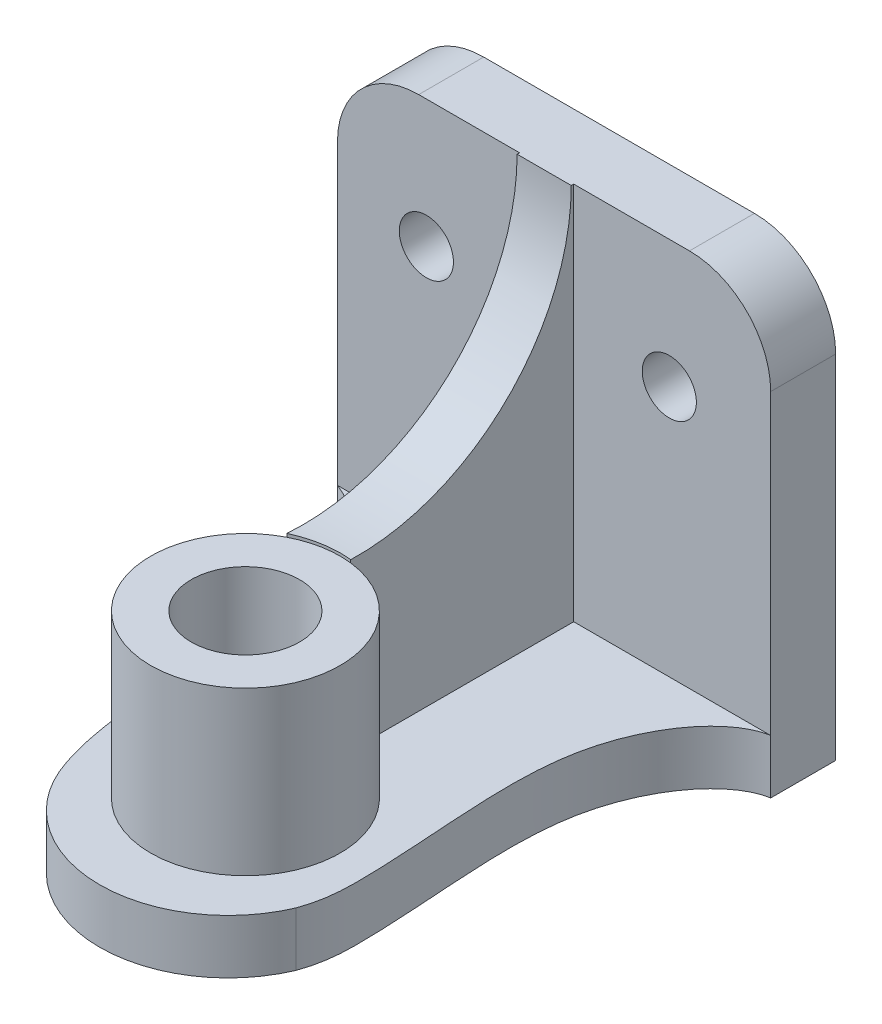
ISO-10303-21;
HEADER;
FILE_DESCRIPTION(('STEP AP214'),'2;1');
FILE_NAME('part.step','',(''),(''),'','','');
FILE_SCHEMA(('AUTOMOTIVE_DESIGN { 1 0 10303 214 1 1 1 1 }'));
ENDSEC;
DATA;
#1=APPLICATION_CONTEXT('core data for automotive mechanical design processes');
#2=APPLICATION_PROTOCOL_DEFINITION('international standard','automotive_design',2000,#1);
#3=PRODUCT_CONTEXT('',#1,'mechanical');
#4=PRODUCT('Part','Part','',(#3));
#5=PRODUCT_RELATED_PRODUCT_CATEGORY('part','',(#4));
#6=PRODUCT_DEFINITION_FORMATION('','',#4);
#7=PRODUCT_DEFINITION_CONTEXT('part definition',#1,'design');
#8=PRODUCT_DEFINITION('design','',#6,#7);
#9=PRODUCT_DEFINITION_SHAPE('','',#8);
#10=(LENGTH_UNIT() NAMED_UNIT(*) SI_UNIT(.MILLI.,.METRE.));
#11=(NAMED_UNIT(*) PLANE_ANGLE_UNIT() SI_UNIT($,.RADIAN.));
#12=(NAMED_UNIT(*) SI_UNIT($,.STERADIAN.) SOLID_ANGLE_UNIT());
#13=UNCERTAINTY_MEASURE_WITH_UNIT(LENGTH_MEASURE(1.E-05),#10,'distance_accuracy_value','');
#14=(GEOMETRIC_REPRESENTATION_CONTEXT(3) GLOBAL_UNCERTAINTY_ASSIGNED_CONTEXT((#13)) GLOBAL_UNIT_ASSIGNED_CONTEXT((#10,
#11,#12)) REPRESENTATION_CONTEXT('',''));
#15=CARTESIAN_POINT('',(0.,0.,0.));
#16=DIRECTION('',(0.,0.,1.));
#17=DIRECTION('',(1.,0.,0.));
#18=AXIS2_PLACEMENT_3D('',#15,#16,#17);
#19=CARTESIAN_POINT('',(27.9984802789048,10.,84.3392480480941));
#20=DIRECTION('',(0.,1.,0.));
#21=DIRECTION('',(0.,0.,1.));
#22=AXIS2_PLACEMENT_3D('',#19,#20,#21);
#23=PLANE('',#22);
#24=DIRECTION('',(-1.,0.,0.));
#25=VECTOR('',#24,1.);
#26=CARTESIAN_POINT('',(0.,10.,0.));
#27=LINE('',#26,#25);
#28=CARTESIAN_POINT('',(80.,9.99999999999999,0.));
#29=VERTEX_POINT('',#28);
#30=CARTESIAN_POINT('',(43.6241003888276,10.,0.));
#31=VERTEX_POINT('',#30);
#32=EDGE_CURVE('E266',#29,#31,#27,.T.);
#33=ORIENTED_EDGE('',*,*,#32,.T.);
#34=DIRECTION('',(0.,0.,-1.));
#35=VECTOR('',#34,1.);
#36=CARTESIAN_POINT('',(43.6241003888276,9.99999999999999,85.8375365464201));
#37=LINE('',#36,#35);
#38=CARTESIAN_POINT('',(43.6241003888276,10.,41.1881518603941));
#39=VERTEX_POINT('',#38);
#40=EDGE_CURVE('E189',#39,#31,#37,.T.);
#41=ORIENTED_EDGE('',*,*,#40,.F.);
#42=CARTESIAN_POINT('',(41.5631874935594,10.,58.5663749582288));
#43=DIRECTION('',(0.,1.,0.));
#44=DIRECTION('',(0.,0.,1.));
#45=AXIS2_PLACEMENT_3D('',#42,#43,#44);
#46=CIRCLE('',#45,17.5);
#47=CARTESIAN_POINT('',(33.6241003888276,10.,42.9708340588729));
#48=VERTEX_POINT('',#47);
#49=EDGE_CURVE('E234',#48,#39,#46,.T.);
#50=ORIENTED_EDGE('',*,*,#49,.F.);
#51=DIRECTION('',(0.,0.,-1.));
#52=VECTOR('',#51,1.);
#53=CARTESIAN_POINT('',(33.6241003888276,9.99999999999999,85.8375365464201));
#54=LINE('',#53,#52);
#55=CARTESIAN_POINT('',(33.6241003888276,9.99999999999999,0.));
#56=VERTEX_POINT('',#55);
#57=EDGE_CURVE('E193',#48,#56,#54,.T.);
#58=ORIENTED_EDGE('',*,*,#57,.T.);
#59=CARTESIAN_POINT('',(0.,10.,0.));
#60=VERTEX_POINT('',#59);
#61=EDGE_CURVE('E264',#56,#60,#27,.T.);
#62=ORIENTED_EDGE('',*,*,#61,.T.);
#63=CARTESIAN_POINT('',(0.,10.,0.));
#64=CARTESIAN_POINT('',(9.56877275415076,10.,3.66225276866932));
#65=CARTESIAN_POINT('',(13.2337926169475,10.,26.3675143986567));
#66=CARTESIAN_POINT('',(14.8929741381569,10.,48.2617371900703));
#67=CARTESIAN_POINT('',(19.4576256927697,10.,73.3825465311833));
#68=CARTESIAN_POINT('',(29.2340281150183,10.,88.8426205390789));
#69=CARTESIAN_POINT('',(47.339429681464,10.,94.9785058066114));
#70=CARTESIAN_POINT('',(65.0726818993575,10.,76.3558704343563));
#71=CARTESIAN_POINT('',(65.4722906220012,10.,49.4997971909519));
#72=CARTESIAN_POINT('',(60.3301523987038,10.,17.8205357279115));
#73=CARTESIAN_POINT('',(73.6733132228618,10.,1.00461477292497));
#74=CARTESIAN_POINT('',(80.0000000000001,10.,0.));
#75=B_SPLINE_CURVE_WITH_KNOTS('',3,(#63,#64,#65,#66,#67,#68,#69,#70,#71,#72,#73,#74),
.UNSPECIFIED.,.F.,.F.,(4,1,1,1,1,1,1,1,1,4),(0.,0.130431735178301,0.366934607313253,
0.41350927472623,0.549603741895093,0.580090258286731,0.687887922250971,0.718701469100994,
0.857412179936937,1.),.UNSPECIFIED.);
#76=CARTESIAN_POINT('',(20.0554863498793,10.,71.3937333383543));
#77=VERTEX_POINT('',#76);
#78=EDGE_CURVE('E257',#60,#77,#75,.T.);
#79=ORIENTED_EDGE('',*,*,#78,.T.);
#80=CARTESIAN_POINT('',(41.9040585860535,10.,62.0892534399399));
#81=DIRECTION('',(0.,1.,0.));
#82=DIRECTION('',(0.,0.,1.));
#83=AXIS2_PLACEMENT_3D('',#80,#81,#82);
#84=CIRCLE('',#83,23.7472831064802);
#85=CARTESIAN_POINT('',(63.7526308222277,10.,71.3937333383543));
#86=VERTEX_POINT('',#85);
#87=EDGE_CURVE('E239',#77,#86,#84,.T.);
#88=ORIENTED_EDGE('',*,*,#87,.T.);
#89=EDGE_CURVE('E265',#86,#29,#75,.T.);
#90=ORIENTED_EDGE('',*,*,#89,.T.);
#91=EDGE_LOOP('',(#33,#41,#50,#58,#62,#79,#88,#90));
#92=FACE_BOUND('',#91,.T.);
#93=ADVANCED_FACE('F39',(#92),#23,.T.);
#94=CARTESIAN_POINT('',(41.5631874935594,40.,58.5663749582288));
#95=DIRECTION('',(0.,-1.,0.));
#96=DIRECTION('',(0.,0.,-1.));
#97=AXIS2_PLACEMENT_3D('',#94,#95,#96);
#98=CYLINDRICAL_SURFACE('',#97,17.5);
#99=DIRECTION('',(0.,-1.,0.));
#100=VECTOR('',#99,1.);
#101=CARTESIAN_POINT('',(43.6241003888276,40.,41.1881518603941));
#102=LINE('',#101,#100);
#103=CARTESIAN_POINT('',(43.6241003888276,40.,41.1881518603941));
#104=VERTEX_POINT('',#103);
#105=EDGE_CURVE('E176',#39,#104,#102,.F.);
#106=ORIENTED_EDGE('',*,*,#105,.T.);
#107=CARTESIAN_POINT('',(41.5631874935594,40.,58.5663749582288));
#108=DIRECTION('',(0.,1.,0.));
#109=DIRECTION('',(0.,0.,1.));
#110=AXIS2_PLACEMENT_3D('',#107,#108,#109);
#111=CIRCLE('',#110,17.5);
#112=CARTESIAN_POINT('',(33.6241003888276,40.,42.9708340588729));
#113=VERTEX_POINT('',#112);
#114=EDGE_CURVE('E240',#113,#104,#111,.T.);
#115=ORIENTED_EDGE('',*,*,#114,.F.);
#116=DIRECTION('',(0.,-1.,0.));
#117=VECTOR('',#116,1.);
#118=CARTESIAN_POINT('',(33.6241003888276,40.,42.9708340588729));
#119=LINE('',#118,#117);
#120=EDGE_CURVE('E63',#113,#48,#119,.T.);
#121=ORIENTED_EDGE('',*,*,#120,.T.);
#122=ORIENTED_EDGE('',*,*,#49,.T.);
#123=EDGE_LOOP('',(#106,#115,#121,#122));
#124=FACE_BOUND('',#123,.T.);
#125=ADVANCED_FACE('F294',(#124),#98,.T.);
#126=CARTESIAN_POINT('',(0.,0.,0.));
#127=DIRECTION('',(0.,0.,-1.));
#128=DIRECTION('',(-1.,0.,0.));
#129=AXIS2_PLACEMENT_3D('',#126,#127,#128);
#130=PLANE('',#129);
#131=CARTESIAN_POINT('',(61.2792038016359,56.4128099895704,0.));
#132=DIRECTION('',(0.,0.,1.));
#133=DIRECTION('',(1.,0.,0.));
#134=AXIS2_PLACEMENT_3D('',#131,#132,#133);
#135=CIRCLE('',#134,4.99999999999999);
#136=CARTESIAN_POINT('',(66.2792038016359,56.4128099895704,0.));
#137=VERTEX_POINT('',#136);
#138=EDGE_CURVE('E424',#137,#137,#135,.T.);
#139=ORIENTED_EDGE('',*,*,#138,.F.);
#140=EDGE_LOOP('',(#139));
#141=FACE_BOUND('',#140,.T.);
#142=DIRECTION('',(0.,1.,0.));
#143=VECTOR('',#142,1.);
#144=CARTESIAN_POINT('',(43.6241003888276,80.,0.));
#145=LINE('',#144,#143);
#146=CARTESIAN_POINT('',(43.6241003888276,80.,0.));
#147=VERTEX_POINT('',#146);
#148=EDGE_CURVE('E174',#31,#147,#145,.T.);
#149=ORIENTED_EDGE('',*,*,#148,.F.);
#150=ORIENTED_EDGE('',*,*,#32,.F.);
#151=DIRECTION('',(0.,-1.,0.));
#152=VECTOR('',#151,1.);
#153=CARTESIAN_POINT('',(80.,80.,0.));
#154=LINE('',#153,#152);
#155=CARTESIAN_POINT('',(80.,65.,0.));
#156=VERTEX_POINT('',#155);
#157=EDGE_CURVE('E197',#156,#29,#154,.T.);
#158=ORIENTED_EDGE('',*,*,#157,.F.);
#159=CARTESIAN_POINT('',(65.,65.,0.));
#160=DIRECTION('',(0.,0.,-1.));
#161=DIRECTION('',(-1.,0.,0.));
#162=AXIS2_PLACEMENT_3D('',#159,#160,#161);
#163=CIRCLE('',#162,15.);
#164=CARTESIAN_POINT('',(65.,80.,0.));
#165=VERTEX_POINT('',#164);
#166=EDGE_CURVE('E337',#156,#165,#163,.F.);
#167=ORIENTED_EDGE('',*,*,#166,.T.);
#168=DIRECTION('',(1.,0.,0.));
#169=VECTOR('',#168,1.);
#170=CARTESIAN_POINT('',(80.,80.,0.));
#171=LINE('',#170,#169);
#172=EDGE_CURVE('E220',#147,#165,#171,.T.);
#173=ORIENTED_EDGE('',*,*,#172,.F.);
#174=EDGE_LOOP('',(#149,#150,#158,#167,#173));
#175=FACE_BOUND('',#174,.T.);
#176=ADVANCED_FACE('F300',(#141,#175),#130,.F.);
#177=CARTESIAN_POINT('',(16.4142916417838,56.4128099895704,0.));
#178=DIRECTION('',(0.,0.,1.));
#179=DIRECTION('',(1.,0.,0.));
#180=AXIS2_PLACEMENT_3D('',#177,#178,#179);
#181=CIRCLE('',#180,4.99999999999999);
#182=CARTESIAN_POINT('',(21.4142916417837,56.4128099895704,0.));
#183=VERTEX_POINT('',#182);
#184=EDGE_CURVE('E416',#183,#183,#181,.T.);
#185=ORIENTED_EDGE('',*,*,#184,.F.);
#186=EDGE_LOOP('',(#185));
#187=FACE_BOUND('',#186,.T.);
#188=DIRECTION('',(0.,-1.,0.));
#189=VECTOR('',#188,1.);
#190=CARTESIAN_POINT('',(33.6241003888276,80.,0.));
#191=LINE('',#190,#189);
#192=CARTESIAN_POINT('',(33.6241003888276,80.,0.));
#193=VERTEX_POINT('',#192);
#194=EDGE_CURVE('E169',#193,#56,#191,.T.);
#195=ORIENTED_EDGE('',*,*,#194,.F.);
#196=CARTESIAN_POINT('',(15.,80.,0.));
#197=VERTEX_POINT('',#196);
#198=EDGE_CURVE('E202',#197,#193,#171,.T.);
#199=ORIENTED_EDGE('',*,*,#198,.F.);
#200=CARTESIAN_POINT('',(15.,65.,0.));
#201=DIRECTION('',(0.,0.,-1.));
#202=DIRECTION('',(-1.,0.,0.));
#203=AXIS2_PLACEMENT_3D('',#200,#201,#202);
#204=CIRCLE('',#203,15.);
#205=CARTESIAN_POINT('',(0.,65.,0.));
#206=VERTEX_POINT('',#205);
#207=EDGE_CURVE('E329',#197,#206,#204,.F.);
#208=ORIENTED_EDGE('',*,*,#207,.T.);
#209=DIRECTION('',(0.,1.,0.));
#210=VECTOR('',#209,1.);
#211=CARTESIAN_POINT('',(0.,80.,0.));
#212=LINE('',#211,#210);
#213=EDGE_CURVE('E216',#60,#206,#212,.T.);
#214=ORIENTED_EDGE('',*,*,#213,.F.);
#215=ORIENTED_EDGE('',*,*,#61,.F.);
#216=EDGE_LOOP('',(#195,#199,#208,#214,#215));
#217=FACE_BOUND('',#216,.T.);
#218=ADVANCED_FACE('F276',(#187,#217),#130,.F.);
#219=DIRECTION('',(0.,-1.,0.));
#220=VECTOR('',#219,1.);
#221=SURFACE_OF_LINEAR_EXTRUSION('',#75,#220);
#222=DIRECTION('',(0.,1.,0.));
#223=VECTOR('',#222,1.);
#224=CARTESIAN_POINT('',(20.0554863498793,0.,71.3937333383543));
#225=LINE('',#224,#223);
#226=CARTESIAN_POINT('',(20.0554863498794,0.,71.3937333383546));
#227=VERTEX_POINT('',#226);
#228=EDGE_CURVE('E250',#227,#77,#225,.T.);
#229=ORIENTED_EDGE('',*,*,#228,.T.);
#230=ORIENTED_EDGE('',*,*,#78,.F.);
#231=DIRECTION('',(0.,-1.,0.));
#232=VECTOR('',#231,1.);
#233=CARTESIAN_POINT('',(0.,10.,0.));
#234=LINE('',#233,#232);
#235=CARTESIAN_POINT('',(0.,0.,0.));
#236=VERTEX_POINT('',#235);
#237=EDGE_CURVE('E331',#60,#236,#234,.T.);
#238=ORIENTED_EDGE('',*,*,#237,.T.);
#239=CARTESIAN_POINT('',(0.,0.,0.));
#240=CARTESIAN_POINT('',(9.56877275415076,0.,3.66225276866932));
#241=CARTESIAN_POINT('',(13.2337926169475,0.,26.3675143986567));
#242=CARTESIAN_POINT('',(14.8929741381569,0.,48.2617371900703));
#243=CARTESIAN_POINT('',(19.4576256927697,0.,73.3825465311833));
#244=CARTESIAN_POINT('',(29.2340281150183,0.,88.8426205390789));
#245=CARTESIAN_POINT('',(47.339429681464,0.,94.9785058066114));
#246=CARTESIAN_POINT('',(65.0726818993575,0.,76.3558704343563));
#247=CARTESIAN_POINT('',(65.4722906220012,0.,49.4997971909519));
#248=CARTESIAN_POINT('',(60.3301523987038,0.,17.8205357279115));
#249=CARTESIAN_POINT('',(73.6733132228618,0.,1.00461477292497));
#250=CARTESIAN_POINT('',(80.0000000000001,0.,0.));
#251=B_SPLINE_CURVE_WITH_KNOTS('',3,(#239,#240,#241,#242,#243,#244,#245,#246,#247,#248,#249,
#250),.UNSPECIFIED.,.F.,.F.,(4,1,1,1,1,1,1,1,1,4),(0.,0.130431735178301,0.366934607313253,
0.41350927472623,0.549603741895093,0.580090258286731,0.687887922250971,0.718701469100994,
0.857412179936937,1.),.UNSPECIFIED.);
#252=EDGE_CURVE('E373',#236,#227,#251,.T.);
#253=ORIENTED_EDGE('',*,*,#252,.T.);
#254=EDGE_LOOP('',(#229,#230,#238,#253));
#255=FACE_BOUND('',#254,.T.);
#256=ADVANCED_FACE('F272',(#255),#221,.F.);
#257=DIRECTION('',(0.,1.,0.));
#258=VECTOR('',#257,1.);
#259=CARTESIAN_POINT('',(63.7526308222277,0.,71.3937333383543));
#260=LINE('',#259,#258);
#261=CARTESIAN_POINT('',(63.7526308222277,0.,71.3937333383543));
#262=VERTEX_POINT('',#261);
#263=EDGE_CURVE('E246',#262,#86,#260,.T.);
#264=ORIENTED_EDGE('',*,*,#263,.F.);
#265=CARTESIAN_POINT('',(80.,0.,0.));
#266=VERTEX_POINT('',#265);
#267=EDGE_CURVE('E254',#262,#266,#251,.T.);
#268=ORIENTED_EDGE('',*,*,#267,.T.);
#269=DIRECTION('',(0.,-1.,0.));
#270=VECTOR('',#269,1.);
#271=CARTESIAN_POINT('',(80.,10.,0.));
#272=LINE('',#271,#270);
#273=EDGE_CURVE('E324',#29,#266,#272,.T.);
#274=ORIENTED_EDGE('',*,*,#273,.F.);
#275=ORIENTED_EDGE('',*,*,#89,.F.);
#276=EDGE_LOOP('',(#264,#268,#274,#275));
#277=FACE_BOUND('',#276,.T.);
#278=ADVANCED_FACE('F275',(#277),#221,.F.);
#279=CARTESIAN_POINT('',(27.9984802789048,0.,84.3392480480941));
#280=DIRECTION('',(0.,1.,0.));
#281=DIRECTION('',(0.,0.,1.));
#282=AXIS2_PLACEMENT_3D('',#279,#280,#281);
#283=PLANE('',#282);
#284=CARTESIAN_POINT('',(41.9040585860535,0.,62.0892534399399));
#285=DIRECTION('',(0.,1.,0.));
#286=DIRECTION('',(0.,0.,1.));
#287=AXIS2_PLACEMENT_3D('',#284,#285,#286);
#288=CIRCLE('',#287,23.7472831064802);
#289=EDGE_CURVE('E243',#227,#262,#288,.T.);
#290=ORIENTED_EDGE('',*,*,#289,.F.);
#291=ORIENTED_EDGE('',*,*,#252,.F.);
#292=DIRECTION('',(0.,0.,1.));
#293=VECTOR('',#292,1.);
#294=CARTESIAN_POINT('',(0.,0.,-12.));
#295=LINE('',#294,#293);
#296=CARTESIAN_POINT('',(0.,0.,-12.));
#297=VERTEX_POINT('',#296);
#298=EDGE_CURVE('E213',#297,#236,#295,.T.);
#299=ORIENTED_EDGE('',*,*,#298,.F.);
#300=DIRECTION('',(-1.,0.,0.));
#301=VECTOR('',#300,1.);
#302=CARTESIAN_POINT('',(80.,0.,-12.));
#303=LINE('',#302,#301);
#304=CARTESIAN_POINT('',(80.,0.,-12.));
#305=VERTEX_POINT('',#304);
#306=EDGE_CURVE('E201',#305,#297,#303,.T.);
#307=ORIENTED_EDGE('',*,*,#306,.F.);
#308=DIRECTION('',(0.,0.,1.));
#309=VECTOR('',#308,1.);
#310=CARTESIAN_POINT('',(80.,0.,-12.));
#311=LINE('',#310,#309);
#312=EDGE_CURVE('E226',#305,#266,#311,.T.);
#313=ORIENTED_EDGE('',*,*,#312,.T.);
#314=ORIENTED_EDGE('',*,*,#267,.F.);
#315=EDGE_LOOP('',(#290,#291,#299,#307,#313,#314));
#316=FACE_BOUND('',#315,.T.);
#317=ADVANCED_FACE('F278',(#316),#283,.F.);
#318=CARTESIAN_POINT('',(41.9040585860535,0.,62.0892534399399));
#319=DIRECTION('',(0.,1.,0.));
#320=DIRECTION('',(0.,0.,1.));
#321=AXIS2_PLACEMENT_3D('',#318,#319,#320);
#322=CYLINDRICAL_SURFACE('',#321,23.7472831064802);
#323=ORIENTED_EDGE('',*,*,#87,.F.);
#324=ORIENTED_EDGE('',*,*,#228,.F.);
#325=ORIENTED_EDGE('',*,*,#289,.T.);
#326=ORIENTED_EDGE('',*,*,#263,.T.);
#327=EDGE_LOOP('',(#323,#324,#325,#326));
#328=FACE_BOUND('',#327,.T.);
#329=ADVANCED_FACE('F396',(#328),#322,.T.);
#330=CARTESIAN_POINT('',(41.5631874935594,40.,58.5663749582288));
#331=DIRECTION('',(0.,1.,0.));
#332=DIRECTION('',(0.,0.,1.));
#333=AXIS2_PLACEMENT_3D('',#330,#331,#332);
#334=PLANE('',#333);
#335=EDGE_CURVE('E235',#104,#113,#111,.T.);
#336=ORIENTED_EDGE('',*,*,#335,.T.);
#337=ORIENTED_EDGE('',*,*,#114,.T.);
#338=EDGE_LOOP('',(#336,#337));
#339=FACE_BOUND('',#338,.T.);
#340=CARTESIAN_POINT('',(41.5631874935594,40.,58.5663749582288));
#341=DIRECTION('',(0.,1.,0.));
#342=DIRECTION('',(0.,0.,1.));
#343=AXIS2_PLACEMENT_3D('',#340,#341,#342);
#344=CIRCLE('',#343,10.);
#345=CARTESIAN_POINT('',(41.5631874935594,40.,68.5663749582288));
#346=VERTEX_POINT('',#345);
#347=EDGE_CURVE('E230',#346,#346,#344,.T.);
#348=ORIENTED_EDGE('',*,*,#347,.F.);
#349=EDGE_LOOP('',(#348));
#350=FACE_BOUND('',#349,.T.);
#351=ADVANCED_FACE('F315',(#339,#350),#334,.T.);
#352=CARTESIAN_POINT('',(41.5631874935594,40.,58.5663749582288));
#353=DIRECTION('',(0.,-1.,0.));
#354=DIRECTION('',(0.,0.,-1.));
#355=AXIS2_PLACEMENT_3D('',#352,#353,#354);
#356=CYLINDRICAL_SURFACE('',#355,10.);
#357=ORIENTED_EDGE('',*,*,#347,.T.);
#358=EDGE_LOOP('',(#357));
#359=FACE_BOUND('',#358,.T.);
#360=CARTESIAN_POINT('',(41.5631874935594,9.99999999999999,58.5663749582288));
#361=DIRECTION('',(0.,1.,0.));
#362=DIRECTION('',(0.,0.,1.));
#363=AXIS2_PLACEMENT_3D('',#360,#361,#362);
#364=CIRCLE('',#363,10.);
#365=CARTESIAN_POINT('',(41.5631874935594,9.99999999999999,68.5663749582288));
#366=VERTEX_POINT('',#365);
#367=EDGE_CURVE('E320',#366,#366,#364,.F.);
#368=ORIENTED_EDGE('',*,*,#367,.T.);
#369=EDGE_LOOP('',(#368));
#370=FACE_BOUND('',#369,.T.);
#371=ADVANCED_FACE('F306',(#359,#370),#356,.F.);
#372=ORIENTED_EDGE('',*,*,#367,.F.);
#373=EDGE_LOOP('',(#372));
#374=FACE_BOUND('',#373,.T.);
#375=ADVANCED_FACE('F296',(#374),#23,.T.);
#376=CARTESIAN_POINT('',(80.,80.,-12.));
#377=DIRECTION('',(-1.,0.,0.));
#378=DIRECTION('',(0.,-1.,0.));
#379=AXIS2_PLACEMENT_3D('',#376,#377,#378);
#380=PLANE('',#379);
#381=DIRECTION('',(0.,-1.,0.));
#382=VECTOR('',#381,1.);
#383=CARTESIAN_POINT('',(80.,80.,-12.));
#384=LINE('',#383,#382);
#385=CARTESIAN_POINT('',(80.,65.,-12.));
#386=VERTEX_POINT('',#385);
#387=EDGE_CURVE('E198',#386,#305,#384,.T.);
#388=ORIENTED_EDGE('',*,*,#387,.F.);
#389=DIRECTION('',(0.,0.,1.));
#390=VECTOR('',#389,1.);
#391=CARTESIAN_POINT('',(80.,65.,-12.));
#392=LINE('',#391,#390);
#393=EDGE_CURVE('E323',#386,#156,#392,.T.);
#394=ORIENTED_EDGE('',*,*,#393,.T.);
#395=ORIENTED_EDGE('',*,*,#157,.T.);
#396=ORIENTED_EDGE('',*,*,#273,.T.);
#397=ORIENTED_EDGE('',*,*,#312,.F.);
#398=EDGE_LOOP('',(#388,#394,#395,#396,#397));
#399=FACE_BOUND('',#398,.T.);
#400=ADVANCED_FACE('F305',(#399),#380,.F.);
#401=CARTESIAN_POINT('',(0.,80.,-12.));
#402=DIRECTION('',(1.,0.,0.));
#403=DIRECTION('',(0.,0.,-1.));
#404=AXIS2_PLACEMENT_3D('',#401,#402,#403);
#405=PLANE('',#404);
#406=ORIENTED_EDGE('',*,*,#213,.T.);
#407=DIRECTION('',(0.,0.,1.));
#408=VECTOR('',#407,1.);
#409=CARTESIAN_POINT('',(0.,65.,-12.));
#410=LINE('',#409,#408);
#411=CARTESIAN_POINT('',(0.,65.,-12.));
#412=VERTEX_POINT('',#411);
#413=EDGE_CURVE('E11',#206,#412,#410,.F.);
#414=ORIENTED_EDGE('',*,*,#413,.T.);
#415=DIRECTION('',(0.,1.,0.));
#416=VECTOR('',#415,1.);
#417=CARTESIAN_POINT('',(0.,80.,-12.));
#418=LINE('',#417,#416);
#419=EDGE_CURVE('E205',#297,#412,#418,.T.);
#420=ORIENTED_EDGE('',*,*,#419,.F.);
#421=ORIENTED_EDGE('',*,*,#298,.T.);
#422=ORIENTED_EDGE('',*,*,#237,.F.);
#423=EDGE_LOOP('',(#406,#414,#420,#421,#422));
#424=FACE_BOUND('',#423,.T.);
#425=ADVANCED_FACE('F312',(#424),#405,.F.);
#426=CARTESIAN_POINT('',(80.,80.,-12.));
#427=DIRECTION('',(0.,-1.,0.));
#428=DIRECTION('',(0.,0.,-1.));
#429=AXIS2_PLACEMENT_3D('',#426,#427,#428);
#430=PLANE('',#429);
#431=DIRECTION('',(0.,0.,-1.));
#432=VECTOR('',#431,1.);
#433=CARTESIAN_POINT('',(33.6241003888276,80.,85.8375365464201));
#434=LINE('',#433,#432);
#435=CARTESIAN_POINT('',(33.6241003888276,80.,0.452210093133544));
#436=VERTEX_POINT('',#435);
#437=EDGE_CURVE('E183',#436,#193,#434,.T.);
#438=ORIENTED_EDGE('',*,*,#437,.F.);
#439=DIRECTION('',(-1.,0.,0.));
#440=VECTOR('',#439,1.);
#441=CARTESIAN_POINT('',(45.6241003888276,80.,0.452210093133537));
#442=LINE('',#441,#440);
#443=CARTESIAN_POINT('',(43.6241003888276,80.,0.452210093133544));
#444=VERTEX_POINT('',#443);
#445=EDGE_CURVE('E55',#436,#444,#442,.F.);
#446=ORIENTED_EDGE('',*,*,#445,.T.);
#447=DIRECTION('',(0.,0.,-1.));
#448=VECTOR('',#447,1.);
#449=CARTESIAN_POINT('',(43.6241003888276,80.,85.8375365464201));
#450=LINE('',#449,#448);
#451=EDGE_CURVE('E186',#444,#147,#450,.T.);
#452=ORIENTED_EDGE('',*,*,#451,.T.);
#453=ORIENTED_EDGE('',*,*,#172,.T.);
#454=DIRECTION('',(0.,0.,1.));
#455=VECTOR('',#454,1.);
#456=CARTESIAN_POINT('',(65.,80.,-12.));
#457=LINE('',#456,#455);
#458=CARTESIAN_POINT('',(65.,80.,-12.));
#459=VERTEX_POINT('',#458);
#460=EDGE_CURVE('E345',#165,#459,#457,.F.);
#461=ORIENTED_EDGE('',*,*,#460,.T.);
#462=DIRECTION('',(1.,0.,0.));
#463=VECTOR('',#462,1.);
#464=CARTESIAN_POINT('',(80.,80.,-12.));
#465=LINE('',#464,#463);
#466=CARTESIAN_POINT('',(15.,80.,-12.));
#467=VERTEX_POINT('',#466);
#468=EDGE_CURVE('E209',#467,#459,#465,.T.);
#469=ORIENTED_EDGE('',*,*,#468,.F.);
#470=DIRECTION('',(0.,0.,1.));
#471=VECTOR('',#470,1.);
#472=CARTESIAN_POINT('',(15.,80.,-12.));
#473=LINE('',#472,#471);
#474=EDGE_CURVE('E341',#467,#197,#473,.T.);
#475=ORIENTED_EDGE('',*,*,#474,.T.);
#476=ORIENTED_EDGE('',*,*,#198,.T.);
#477=EDGE_LOOP('',(#438,#446,#452,#453,#461,#469,#475,#476));
#478=FACE_BOUND('',#477,.T.);
#479=ADVANCED_FACE('F289',(#478),#430,.F.);
#480=CARTESIAN_POINT('',(0.,0.,-12.));
#481=DIRECTION('',(0.,0.,-1.));
#482=DIRECTION('',(-1.,0.,0.));
#483=AXIS2_PLACEMENT_3D('',#480,#481,#482);
#484=PLANE('',#483);
#485=CARTESIAN_POINT('',(61.2792038016359,56.4128099895704,-12.));
#486=DIRECTION('',(0.,0.,1.));
#487=DIRECTION('',(1.,0.,0.));
#488=AXIS2_PLACEMENT_3D('',#485,#486,#487);
#489=CIRCLE('',#488,5.);
#490=CARTESIAN_POINT('',(66.2792038016359,56.4128099895704,-12.));
#491=VERTEX_POINT('',#490);
#492=EDGE_CURVE('E420',#491,#491,#489,.T.);
#493=ORIENTED_EDGE('',*,*,#492,.T.);
#494=EDGE_LOOP('',(#493));
#495=FACE_BOUND('',#494,.T.);
#496=CARTESIAN_POINT('',(16.4142916417838,56.4128099895704,-12.));
#497=DIRECTION('',(0.,0.,1.));
#498=DIRECTION('',(1.,0.,0.));
#499=AXIS2_PLACEMENT_3D('',#496,#497,#498);
#500=CIRCLE('',#499,5.);
#501=CARTESIAN_POINT('',(21.4142916417838,56.4128099895704,-12.));
#502=VERTEX_POINT('',#501);
#503=EDGE_CURVE('E155',#502,#502,#500,.T.);
#504=ORIENTED_EDGE('',*,*,#503,.T.);
#505=EDGE_LOOP('',(#504));
#506=FACE_BOUND('',#505,.T.);
#507=ORIENTED_EDGE('',*,*,#468,.T.);
#508=CARTESIAN_POINT('',(65.,65.,-12.));
#509=DIRECTION('',(0.,0.,-1.));
#510=DIRECTION('',(-1.,0.,0.));
#511=AXIS2_PLACEMENT_3D('',#508,#509,#510);
#512=CIRCLE('',#511,15.);
#513=EDGE_CURVE('E48',#459,#386,#512,.T.);
#514=ORIENTED_EDGE('',*,*,#513,.T.);
#515=ORIENTED_EDGE('',*,*,#387,.T.);
#516=ORIENTED_EDGE('',*,*,#306,.T.);
#517=ORIENTED_EDGE('',*,*,#419,.T.);
#518=CARTESIAN_POINT('',(15.,65.,-12.));
#519=DIRECTION('',(0.,0.,-1.));
#520=DIRECTION('',(-1.,0.,0.));
#521=AXIS2_PLACEMENT_3D('',#518,#519,#520);
#522=CIRCLE('',#521,15.);
#523=EDGE_CURVE('E348',#412,#467,#522,.T.);
#524=ORIENTED_EDGE('',*,*,#523,.T.);
#525=EDGE_LOOP('',(#507,#514,#515,#516,#517,#524));
#526=FACE_BOUND('',#525,.T.);
#527=ADVANCED_FACE('F282',(#495,#506,#526),#484,.T.);
#528=CARTESIAN_POINT('',(65.,65.,-12.));
#529=DIRECTION('',(0.,0.,1.));
#530=DIRECTION('',(1.,0.,0.));
#531=AXIS2_PLACEMENT_3D('',#528,#529,#530);
#532=CYLINDRICAL_SURFACE('',#531,15.);
#533=ORIENTED_EDGE('',*,*,#513,.F.);
#534=ORIENTED_EDGE('',*,*,#460,.F.);
#535=ORIENTED_EDGE('',*,*,#166,.F.);
#536=ORIENTED_EDGE('',*,*,#393,.F.);
#537=EDGE_LOOP('',(#533,#534,#535,#536));
#538=FACE_BOUND('',#537,.T.);
#539=ADVANCED_FACE('F280',(#538),#532,.T.);
#540=CARTESIAN_POINT('',(15.,65.,-12.));
#541=DIRECTION('',(0.,0.,1.));
#542=DIRECTION('',(1.,0.,0.));
#543=AXIS2_PLACEMENT_3D('',#540,#541,#542);
#544=CYLINDRICAL_SURFACE('',#543,15.);
#545=ORIENTED_EDGE('',*,*,#523,.F.);
#546=ORIENTED_EDGE('',*,*,#413,.F.);
#547=ORIENTED_EDGE('',*,*,#207,.F.);
#548=ORIENTED_EDGE('',*,*,#474,.F.);
#549=EDGE_LOOP('',(#545,#546,#547,#548));
#550=FACE_BOUND('',#549,.T.);
#551=ADVANCED_FACE('F41',(#550),#544,.T.);
#552=CARTESIAN_POINT('',(41.5631874935594,40.,58.5663749582288));
#553=DIRECTION('',(0.,-1.,0.));
#554=DIRECTION('',(0.,0.,-1.));
#555=AXIS2_PLACEMENT_3D('',#552,#553,#554);
#556=CYLINDRICAL_SURFACE('',#555,17.5);
#557=CARTESIAN_POINT('',(33.6241003888276,40.6155118180588,42.9708340588729));
#558=CARTESIAN_POINT('',(33.845437149912,40.6068780052273,42.8581601743405));
#559=CARTESIAN_POINT('',(34.0691694620821,40.5990874185328,42.7502006303074));
#560=CARTESIAN_POINT('',(34.5210636281354,40.584978200363,42.543884446791));
#561=CARTESIAN_POINT('',(34.7492254676615,40.5786595641175,42.4455277761888));
#562=CARTESIAN_POINT('',(35.439743840045,40.561591524663,42.1651512988549));
#563=CARTESIAN_POINT('',(35.9082019837763,40.5527274503189,41.9977900317076));
#564=CARTESIAN_POINT('',(36.8461464680913,40.538740864602,41.7071091641132));
#565=CARTESIAN_POINT('',(37.3153342300209,40.5335330896771,41.582822757448));
#566=CARTESIAN_POINT('',(38.2623721662402,40.525444958566,41.3736546507472));
#567=CARTESIAN_POINT('',(38.7402203475611,40.5225640736891,41.2887640014992));
#568=CARTESIAN_POINT('',(39.5820104785039,40.5189039066532,41.1750572453712));
#569=CARTESIAN_POINT('',(39.9448053655224,40.5177805789163,41.1375550595198));
#570=CARTESIAN_POINT('',(40.6719969066234,40.516246083587,41.0852815829611));
#571=CARTESIAN_POINT('',(41.0363933266543,40.515834815189,41.0705070747508));
#572=CARTESIAN_POINT('',(41.7721812120381,40.5156390386499,41.063685046989));
#573=CARTESIAN_POINT('',(42.143576626842,40.5158663395101,41.0720656862937));
#574=CARTESIAN_POINT('',(42.8851466102586,40.5170437145013,41.1124214522485));
#575=CARTESIAN_POINT('',(43.2553209556346,40.5179939141553,41.1444006764863));
#576=CARTESIAN_POINT('',(43.6241003888276,40.5193408369624,41.1881518603941));
#577=B_SPLINE_CURVE_WITH_KNOTS('',3,(#557,#558,#559,#560,#561,#562,#563,#564,#565,#566,#567,
#568,#569,#570,#571,#572,#573,#574,#575,#576),.UNSPECIFIED.,.F.,.F.,(4,2,2,2,2,2,2,2,2,4),(0.,
0.745423030625076,1.49084364556519,2.98145406701559,4.43603271422909,5.8902807747576,
6.98380169459778,8.07716779304246,9.19088578939274,10.3047972139144),.UNSPECIFIED.);
#578=CARTESIAN_POINT('',(33.6241003888276,40.6155118180588,42.9708340588729));
#579=VERTEX_POINT('',#578);
#580=CARTESIAN_POINT('',(43.6241003888276,40.5193408369624,41.1881518603941));
#581=VERTEX_POINT('',#580);
#582=EDGE_CURVE('E148',#579,#581,#577,.T.);
#583=ORIENTED_EDGE('',*,*,#582,.F.);
#584=EDGE_CURVE('E161',#579,#113,#119,.T.);
#585=ORIENTED_EDGE('',*,*,#584,.T.);
#586=ORIENTED_EDGE('',*,*,#335,.F.);
#587=EDGE_CURVE('E163',#104,#581,#102,.F.);
#588=ORIENTED_EDGE('',*,*,#587,.T.);
#589=EDGE_LOOP('',(#583,#585,#586,#588));
#590=FACE_BOUND('',#589,.T.);
#591=ADVANCED_FACE('F159',(#590),#556,.F.);
#592=CARTESIAN_POINT('',(43.6241003888276,80.,85.8375365464201));
#593=DIRECTION('',(-1.,0.,0.));
#594=DIRECTION('',(0.,-1.,0.));
#595=AXIS2_PLACEMENT_3D('',#592,#593,#594);
#596=PLANE('',#595);
#597=ORIENTED_EDGE('',*,*,#451,.F.);
#598=CARTESIAN_POINT('',(43.6241003888276,80.,39.9522100931335));
#599=DIRECTION('',(-1.,0.,0.));
#600=DIRECTION('',(0.,-1.,0.));
#601=AXIS2_PLACEMENT_3D('',#598,#599,#600);
#602=CIRCLE('',#601,39.5);
#603=EDGE_CURVE('E154',#444,#581,#602,.T.);
#604=ORIENTED_EDGE('',*,*,#603,.T.);
#605=ORIENTED_EDGE('',*,*,#587,.F.);
#606=ORIENTED_EDGE('',*,*,#105,.F.);
#607=ORIENTED_EDGE('',*,*,#40,.T.);
#608=ORIENTED_EDGE('',*,*,#148,.T.);
#609=EDGE_LOOP('',(#597,#604,#605,#606,#607,#608));
#610=FACE_BOUND('',#609,.T.);
#611=ADVANCED_FACE('F403',(#610),#596,.F.);
#612=CARTESIAN_POINT('',(33.6241003888276,80.,85.8375365464201));
#613=DIRECTION('',(1.,0.,0.));
#614=DIRECTION('',(0.,0.,-1.));
#615=AXIS2_PLACEMENT_3D('',#612,#613,#614);
#616=PLANE('',#615);
#617=ORIENTED_EDGE('',*,*,#584,.F.);
#618=CARTESIAN_POINT('',(33.6241003888276,80.,39.9522100931335));
#619=DIRECTION('',(-1.,0.,0.));
#620=DIRECTION('',(0.,0.,1.));
#621=AXIS2_PLACEMENT_3D('',#618,#619,#620);
#622=CIRCLE('',#621,39.5);
#623=EDGE_CURVE('E145',#436,#579,#622,.T.);
#624=ORIENTED_EDGE('',*,*,#623,.F.);
#625=ORIENTED_EDGE('',*,*,#437,.T.);
#626=ORIENTED_EDGE('',*,*,#194,.T.);
#627=ORIENTED_EDGE('',*,*,#57,.F.);
#628=ORIENTED_EDGE('',*,*,#120,.F.);
#629=EDGE_LOOP('',(#617,#624,#625,#626,#627,#628));
#630=FACE_BOUND('',#629,.T.);
#631=ADVANCED_FACE('F166',(#630),#616,.F.);
#632=CARTESIAN_POINT('',(45.6241003888276,80.,39.9522100931335));
#633=DIRECTION('',(-1.,0.,0.));
#634=DIRECTION('',(0.,0.,1.));
#635=AXIS2_PLACEMENT_3D('',#632,#633,#634);
#636=CYLINDRICAL_SURFACE('',#635,39.5);
#637=ORIENTED_EDGE('',*,*,#623,.T.);
#638=ORIENTED_EDGE('',*,*,#582,.T.);
#639=ORIENTED_EDGE('',*,*,#603,.F.);
#640=ORIENTED_EDGE('',*,*,#445,.F.);
#641=EDGE_LOOP('',(#637,#638,#639,#640));
#642=FACE_BOUND('',#641,.T.);
#643=ADVANCED_FACE('F147',(#642),#636,.F.);
#644=CARTESIAN_POINT('',(16.4142916417838,56.4128099895704,0.));
#645=DIRECTION('',(0.,0.,1.));
#646=DIRECTION('',(1.,0.,0.));
#647=AXIS2_PLACEMENT_3D('',#644,#645,#646);
#648=CYLINDRICAL_SURFACE('',#647,4.99999999999999);
#649=ORIENTED_EDGE('',*,*,#503,.F.);
#650=EDGE_LOOP('',(#649));
#651=FACE_BOUND('',#650,.T.);
#652=ORIENTED_EDGE('',*,*,#184,.T.);
#653=EDGE_LOOP('',(#652));
#654=FACE_BOUND('',#653,.T.);
#655=ADVANCED_FACE('F441',(#651,#654),#648,.F.);
#656=CARTESIAN_POINT('',(61.2792038016359,56.4128099895704,0.));
#657=DIRECTION('',(0.,0.,1.));
#658=DIRECTION('',(1.,0.,0.));
#659=AXIS2_PLACEMENT_3D('',#656,#657,#658);
#660=CYLINDRICAL_SURFACE('',#659,5.);
#661=ORIENTED_EDGE('',*,*,#492,.F.);
#662=EDGE_LOOP('',(#661));
#663=FACE_BOUND('',#662,.T.);
#664=ORIENTED_EDGE('',*,*,#138,.T.);
#665=EDGE_LOOP('',(#664));
#666=FACE_BOUND('',#665,.T.);
#667=ADVANCED_FACE('F444',(#663,#666),#660,.F.);
#668=CLOSED_SHELL('',(#93,#125,#176,#218,#256,#278,#317,#329,#351,#371,#375,#400,#425,#479,#527,
#539,#551,#591,#611,#631,#643,#655,#667));
#669=MANIFOLD_SOLID_BREP('B2',#668);
#670=ADVANCED_BREP_SHAPE_REPRESENTATION('',(#18,#669),#14);
#671=SHAPE_DEFINITION_REPRESENTATION(#9,#670);
ENDSEC;
END-ISO-10303-21;
